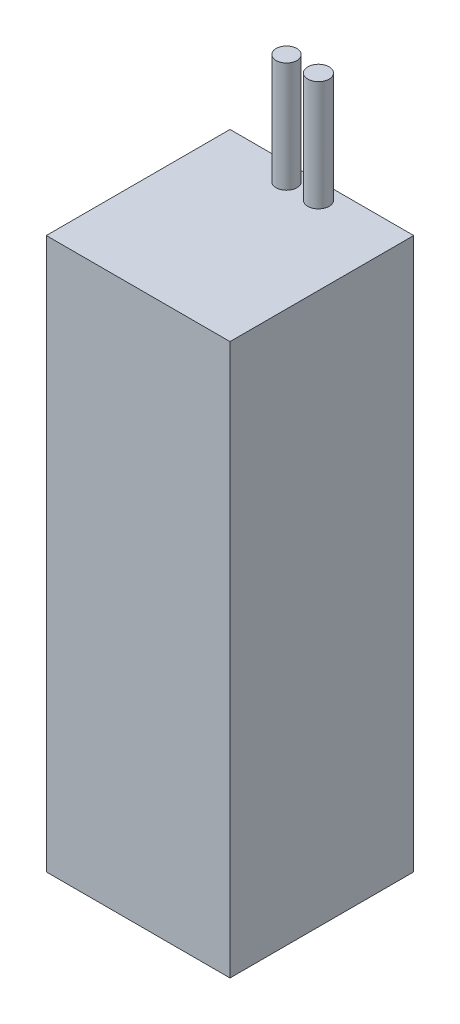
ISO-10303-21;
HEADER;
FILE_DESCRIPTION(('STEP AP214'),'2;1');
FILE_NAME('part.step','',(''),(''),'','','');
FILE_SCHEMA(('AUTOMOTIVE_DESIGN { 1 0 10303 214 1 1 1 1 }'));
ENDSEC;
DATA;
#1=APPLICATION_CONTEXT('core data for automotive mechanical design processes');
#2=APPLICATION_PROTOCOL_DEFINITION('international standard','automotive_design',2000,#1);
#3=PRODUCT_CONTEXT('',#1,'mechanical');
#4=PRODUCT('Part','Part','',(#3));
#5=PRODUCT_RELATED_PRODUCT_CATEGORY('part','',(#4));
#6=PRODUCT_DEFINITION_FORMATION('','',#4);
#7=PRODUCT_DEFINITION_CONTEXT('part definition',#1,'design');
#8=PRODUCT_DEFINITION('design','',#6,#7);
#9=PRODUCT_DEFINITION_SHAPE('','',#8);
#10=(LENGTH_UNIT() NAMED_UNIT(*) SI_UNIT(.MILLI.,.METRE.));
#11=(NAMED_UNIT(*) PLANE_ANGLE_UNIT() SI_UNIT($,.RADIAN.));
#12=(NAMED_UNIT(*) SI_UNIT($,.STERADIAN.) SOLID_ANGLE_UNIT());
#13=UNCERTAINTY_MEASURE_WITH_UNIT(LENGTH_MEASURE(1.E-05),#10,'distance_accuracy_value','');
#14=(GEOMETRIC_REPRESENTATION_CONTEXT(3) GLOBAL_UNCERTAINTY_ASSIGNED_CONTEXT((#13)) GLOBAL_UNIT_ASSIGNED_CONTEXT((#10,
#11,#12)) REPRESENTATION_CONTEXT('',''));
#15=CARTESIAN_POINT('',(0.,0.,0.));
#16=DIRECTION('',(0.,0.,1.));
#17=DIRECTION('',(1.,0.,0.));
#18=AXIS2_PLACEMENT_3D('',#15,#16,#17);
#19=CARTESIAN_POINT('',(0.,150.,0.));
#20=DIRECTION('',(1.,0.,0.));
#21=DIRECTION('',(0.,0.,-1.));
#22=AXIS2_PLACEMENT_3D('',#19,#20,#21);
#23=PLANE('',#22);
#24=DIRECTION('',(0.,0.,1.));
#25=VECTOR('',#24,1.);
#26=CARTESIAN_POINT('',(0.,0.,0.));
#27=LINE('',#26,#25);
#28=CARTESIAN_POINT('',(0.,0.,-50.));
#29=VERTEX_POINT('',#28);
#30=CARTESIAN_POINT('',(0.,0.,0.));
#31=VERTEX_POINT('',#30);
#32=EDGE_CURVE('E111',#29,#31,#27,.T.);
#33=ORIENTED_EDGE('',*,*,#32,.T.);
#34=DIRECTION('',(0.,-1.,0.));
#35=VECTOR('',#34,1.);
#36=CARTESIAN_POINT('',(0.,150.,0.));
#37=LINE('',#36,#35);
#38=CARTESIAN_POINT('',(0.,150.,0.));
#39=VERTEX_POINT('',#38);
#40=EDGE_CURVE('E100',#39,#31,#37,.T.);
#41=ORIENTED_EDGE('',*,*,#40,.F.);
#42=DIRECTION('',(0.,0.,1.));
#43=VECTOR('',#42,1.);
#44=CARTESIAN_POINT('',(0.,150.,0.));
#45=LINE('',#44,#43);
#46=CARTESIAN_POINT('',(0.,150.,-50.));
#47=VERTEX_POINT('',#46);
#48=EDGE_CURVE('E92',#47,#39,#45,.T.);
#49=ORIENTED_EDGE('',*,*,#48,.F.);
#50=DIRECTION('',(0.,-1.,0.));
#51=VECTOR('',#50,1.);
#52=CARTESIAN_POINT('',(0.,150.,-50.));
#53=LINE('',#52,#51);
#54=EDGE_CURVE('E107',#47,#29,#53,.T.);
#55=ORIENTED_EDGE('',*,*,#54,.T.);
#56=EDGE_LOOP('',(#33,#41,#49,#55));
#57=FACE_BOUND('',#56,.T.);
#58=ADVANCED_FACE('F39',(#57),#23,.F.);
#59=CARTESIAN_POINT('',(0.,150.,0.));
#60=DIRECTION('',(0.,0.,-1.));
#61=DIRECTION('',(-1.,0.,0.));
#62=AXIS2_PLACEMENT_3D('',#59,#60,#61);
#63=PLANE('',#62);
#64=DIRECTION('',(1.,0.,0.));
#65=VECTOR('',#64,1.);
#66=CARTESIAN_POINT('',(0.,0.,0.));
#67=LINE('',#66,#65);
#68=CARTESIAN_POINT('',(50.,0.,0.));
#69=VERTEX_POINT('',#68);
#70=EDGE_CURVE('E98',#31,#69,#67,.T.);
#71=ORIENTED_EDGE('',*,*,#70,.T.);
#72=DIRECTION('',(0.,-1.,0.));
#73=VECTOR('',#72,1.);
#74=CARTESIAN_POINT('',(50.,150.,0.));
#75=LINE('',#74,#73);
#76=CARTESIAN_POINT('',(50.,150.,0.));
#77=VERTEX_POINT('',#76);
#78=EDGE_CURVE('E96',#77,#69,#75,.T.);
#79=ORIENTED_EDGE('',*,*,#78,.F.);
#80=DIRECTION('',(1.,0.,0.));
#81=VECTOR('',#80,1.);
#82=CARTESIAN_POINT('',(0.,150.,0.));
#83=LINE('',#82,#81);
#84=EDGE_CURVE('E87',#39,#77,#83,.T.);
#85=ORIENTED_EDGE('',*,*,#84,.F.);
#86=ORIENTED_EDGE('',*,*,#40,.T.);
#87=EDGE_LOOP('',(#71,#79,#85,#86));
#88=FACE_BOUND('',#87,.T.);
#89=ADVANCED_FACE('F97',(#88),#63,.F.);
#90=CARTESIAN_POINT('',(50.,150.,0.));
#91=DIRECTION('',(-1.,0.,0.));
#92=DIRECTION('',(0.,0.,1.));
#93=AXIS2_PLACEMENT_3D('',#90,#91,#92);
#94=PLANE('',#93);
#95=DIRECTION('',(0.,0.,-1.));
#96=VECTOR('',#95,1.);
#97=CARTESIAN_POINT('',(50.,0.,0.));
#98=LINE('',#97,#96);
#99=CARTESIAN_POINT('',(50.,0.,-50.));
#100=VERTEX_POINT('',#99);
#101=EDGE_CURVE('E73',#69,#100,#98,.T.);
#102=ORIENTED_EDGE('',*,*,#101,.T.);
#103=DIRECTION('',(0.,-1.,0.));
#104=VECTOR('',#103,1.);
#105=CARTESIAN_POINT('',(50.,150.,-50.));
#106=LINE('',#105,#104);
#107=CARTESIAN_POINT('',(50.,150.,-50.));
#108=VERTEX_POINT('',#107);
#109=EDGE_CURVE('E101',#108,#100,#106,.T.);
#110=ORIENTED_EDGE('',*,*,#109,.F.);
#111=DIRECTION('',(0.,0.,-1.));
#112=VECTOR('',#111,1.);
#113=CARTESIAN_POINT('',(50.,150.,0.));
#114=LINE('',#113,#112);
#115=EDGE_CURVE('E90',#77,#108,#114,.T.);
#116=ORIENTED_EDGE('',*,*,#115,.F.);
#117=ORIENTED_EDGE('',*,*,#78,.T.);
#118=EDGE_LOOP('',(#102,#110,#116,#117));
#119=FACE_BOUND('',#118,.T.);
#120=ADVANCED_FACE('F103',(#119),#94,.F.);
#121=CARTESIAN_POINT('',(0.,150.,-50.));
#122=DIRECTION('',(0.,0.,1.));
#123=DIRECTION('',(1.,0.,0.));
#124=AXIS2_PLACEMENT_3D('',#121,#122,#123);
#125=PLANE('',#124);
#126=DIRECTION('',(-1.,0.,0.));
#127=VECTOR('',#126,1.);
#128=CARTESIAN_POINT('',(0.,0.,-50.));
#129=LINE('',#128,#127);
#130=EDGE_CURVE('E79',#100,#29,#129,.T.);
#131=ORIENTED_EDGE('',*,*,#130,.T.);
#132=ORIENTED_EDGE('',*,*,#54,.F.);
#133=DIRECTION('',(-1.,0.,0.));
#134=VECTOR('',#133,1.);
#135=CARTESIAN_POINT('',(0.,150.,-50.));
#136=LINE('',#135,#134);
#137=EDGE_CURVE('E56',#108,#47,#136,.T.);
#138=ORIENTED_EDGE('',*,*,#137,.F.);
#139=ORIENTED_EDGE('',*,*,#109,.T.);
#140=EDGE_LOOP('',(#131,#132,#138,#139));
#141=FACE_BOUND('',#140,.T.);
#142=ADVANCED_FACE('F135',(#141),#125,.F.);
#143=CARTESIAN_POINT('',(0.,150.,0.));
#144=DIRECTION('',(0.,-1.,0.));
#145=DIRECTION('',(0.,0.,-1.));
#146=AXIS2_PLACEMENT_3D('',#143,#144,#145);
#147=PLANE('',#146);
#148=CARTESIAN_POINT('',(28.7151757442452,150.,-45.3544203009186));
#149=DIRECTION('',(0.,-1.,0.));
#150=DIRECTION('',(0.,0.,-1.));
#151=AXIS2_PLACEMENT_3D('',#148,#149,#150);
#152=CIRCLE('',#151,2.90004031060366);
#153=CARTESIAN_POINT('',(28.7151757442452,150.,-48.2544606115223));
#154=VERTEX_POINT('',#153);
#155=EDGE_CURVE('E11',#154,#154,#152,.F.);
#156=ORIENTED_EDGE('',*,*,#155,.F.);
#157=EDGE_LOOP('',(#156));
#158=FACE_BOUND('',#157,.T.);
#159=CARTESIAN_POINT('',(20.0200835768627,150.,-45.3544203009186));
#160=DIRECTION('',(0.,-1.,0.));
#161=DIRECTION('',(0.,0.,-1.));
#162=AXIS2_PLACEMENT_3D('',#159,#160,#161);
#163=CIRCLE('',#162,2.83356427595286);
#164=CARTESIAN_POINT('',(20.0200835768627,150.,-48.1879845768715));
#165=VERTEX_POINT('',#164);
#166=EDGE_CURVE('E48',#165,#165,#163,.F.);
#167=ORIENTED_EDGE('',*,*,#166,.F.);
#168=EDGE_LOOP('',(#167));
#169=FACE_BOUND('',#168,.T.);
#170=ORIENTED_EDGE('',*,*,#48,.T.);
#171=ORIENTED_EDGE('',*,*,#84,.T.);
#172=ORIENTED_EDGE('',*,*,#115,.T.);
#173=ORIENTED_EDGE('',*,*,#137,.T.);
#174=EDGE_LOOP('',(#170,#171,#172,#173));
#175=FACE_BOUND('',#174,.T.);
#176=ADVANCED_FACE('F88',(#158,#169,#175),#147,.F.);
#177=CARTESIAN_POINT('',(0.,0.,0.));
#178=DIRECTION('',(0.,-1.,0.));
#179=DIRECTION('',(0.,0.,-1.));
#180=AXIS2_PLACEMENT_3D('',#177,#178,#179);
#181=PLANE('',#180);
#182=ORIENTED_EDGE('',*,*,#32,.F.);
#183=ORIENTED_EDGE('',*,*,#130,.F.);
#184=ORIENTED_EDGE('',*,*,#101,.F.);
#185=ORIENTED_EDGE('',*,*,#70,.F.);
#186=EDGE_LOOP('',(#182,#183,#184,#185));
#187=FACE_BOUND('',#186,.T.);
#188=ADVANCED_FACE('F134',(#187),#181,.T.);
#189=CARTESIAN_POINT('',(20.0200835768627,180.,-45.3544203009186));
#190=DIRECTION('',(0.,-1.,0.));
#191=DIRECTION('',(0.,0.,-1.));
#192=AXIS2_PLACEMENT_3D('',#189,#190,#191);
#193=CYLINDRICAL_SURFACE('',#192,2.83356427595286);
#194=CARTESIAN_POINT('',(20.0200835768627,180.,-45.3544203009186));
#195=DIRECTION('',(0.,1.,0.));
#196=DIRECTION('',(0.,0.,1.));
#197=AXIS2_PLACEMENT_3D('',#194,#195,#196);
#198=CIRCLE('',#197,2.83356427595286);
#199=CARTESIAN_POINT('',(20.0200835768627,180.,-42.5208560249658));
#200=VERTEX_POINT('',#199);
#201=EDGE_CURVE('E115',#200,#200,#198,.T.);
#202=ORIENTED_EDGE('',*,*,#201,.F.);
#203=EDGE_LOOP('',(#202));
#204=FACE_BOUND('',#203,.T.);
#205=ORIENTED_EDGE('',*,*,#166,.T.);
#206=EDGE_LOOP('',(#205));
#207=FACE_BOUND('',#206,.T.);
#208=ADVANCED_FACE('F131',(#204,#207),#193,.T.);
#209=CARTESIAN_POINT('',(20.0200835768627,180.,-45.3544203009186));
#210=DIRECTION('',(0.,1.,0.));
#211=DIRECTION('',(0.,0.,1.));
#212=AXIS2_PLACEMENT_3D('',#209,#210,#211);
#213=PLANE('',#212);
#214=ORIENTED_EDGE('',*,*,#201,.T.);
#215=EDGE_LOOP('',(#214));
#216=FACE_BOUND('',#215,.T.);
#217=ADVANCED_FACE('F168',(#216),#213,.T.);
#218=CARTESIAN_POINT('',(28.7151757442452,180.,-45.3544203009186));
#219=DIRECTION('',(0.,-1.,0.));
#220=DIRECTION('',(0.,0.,-1.));
#221=AXIS2_PLACEMENT_3D('',#218,#219,#220);
#222=CYLINDRICAL_SURFACE('',#221,2.90004031060366);
#223=CARTESIAN_POINT('',(28.7151757442452,180.,-45.3544203009186));
#224=DIRECTION('',(0.,1.,0.));
#225=DIRECTION('',(0.,0.,1.));
#226=AXIS2_PLACEMENT_3D('',#223,#224,#225);
#227=CIRCLE('',#226,2.90004031060366);
#228=CARTESIAN_POINT('',(28.7151757442452,180.,-42.454379990315));
#229=VERTEX_POINT('',#228);
#230=EDGE_CURVE('E158',#229,#229,#227,.T.);
#231=ORIENTED_EDGE('',*,*,#230,.F.);
#232=EDGE_LOOP('',(#231));
#233=FACE_BOUND('',#232,.T.);
#234=ORIENTED_EDGE('',*,*,#155,.T.);
#235=EDGE_LOOP('',(#234));
#236=FACE_BOUND('',#235,.T.);
#237=ADVANCED_FACE('F165',(#233,#236),#222,.T.);
#238=CARTESIAN_POINT('',(28.7151757442452,180.,-45.3544203009186));
#239=DIRECTION('',(0.,1.,0.));
#240=DIRECTION('',(0.,0.,1.));
#241=AXIS2_PLACEMENT_3D('',#238,#239,#240);
#242=PLANE('',#241);
#243=ORIENTED_EDGE('',*,*,#230,.T.);
#244=EDGE_LOOP('',(#243));
#245=FACE_BOUND('',#244,.T.);
#246=ADVANCED_FACE('F163',(#245),#242,.T.);
#247=CLOSED_SHELL('',(#58,#89,#120,#142,#176,#188,#208,#217,#237,#246));
#248=MANIFOLD_SOLID_BREP('B2',#247);
#249=ADVANCED_BREP_SHAPE_REPRESENTATION('',(#18,#248),#14);
#250=SHAPE_DEFINITION_REPRESENTATION(#9,#249);
ENDSEC;
END-ISO-10303-21;
